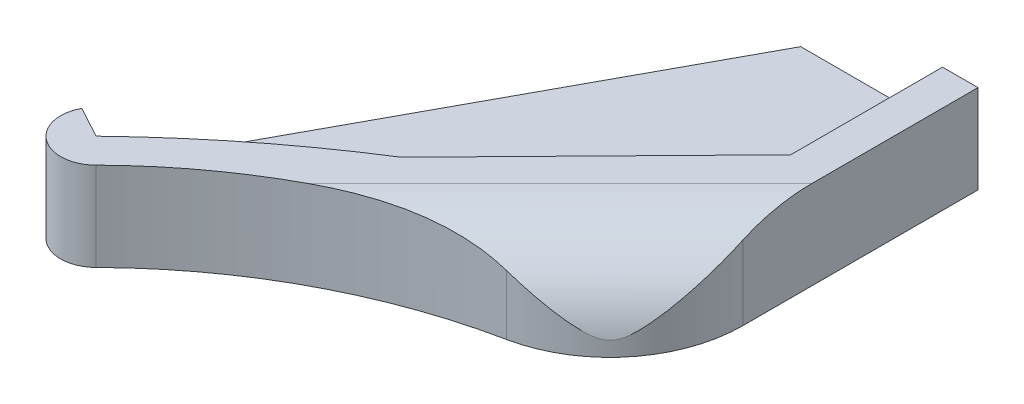
ISO-10303-21;
HEADER;
FILE_DESCRIPTION(('STEP AP214'),'2;1');
FILE_NAME('part.step','',(''),(''),'','','');
FILE_SCHEMA(('AUTOMOTIVE_DESIGN { 1 0 10303 214 1 1 1 1 }'));
ENDSEC;
DATA;
#1=APPLICATION_CONTEXT('core data for automotive mechanical design processes');
#2=APPLICATION_PROTOCOL_DEFINITION('international standard','automotive_design',2000,#1);
#3=PRODUCT_CONTEXT('',#1,'mechanical');
#4=PRODUCT('Part','Part','',(#3));
#5=PRODUCT_RELATED_PRODUCT_CATEGORY('part','',(#4));
#6=PRODUCT_DEFINITION_FORMATION('','',#4);
#7=PRODUCT_DEFINITION_CONTEXT('part definition',#1,'design');
#8=PRODUCT_DEFINITION('design','',#6,#7);
#9=PRODUCT_DEFINITION_SHAPE('','',#8);
#10=(LENGTH_UNIT() NAMED_UNIT(*) SI_UNIT(.MILLI.,.METRE.));
#11=(NAMED_UNIT(*) PLANE_ANGLE_UNIT() SI_UNIT($,.RADIAN.));
#12=(NAMED_UNIT(*) SI_UNIT($,.STERADIAN.) SOLID_ANGLE_UNIT());
#13=UNCERTAINTY_MEASURE_WITH_UNIT(LENGTH_MEASURE(1.E-05),#10,'distance_accuracy_value','');
#14=(GEOMETRIC_REPRESENTATION_CONTEXT(3) GLOBAL_UNCERTAINTY_ASSIGNED_CONTEXT((#13)) GLOBAL_UNIT_ASSIGNED_CONTEXT((#10,
#11,#12)) REPRESENTATION_CONTEXT('',''));
#15=CARTESIAN_POINT('',(0.,0.,0.));
#16=DIRECTION('',(0.,0.,1.));
#17=DIRECTION('',(1.,0.,0.));
#18=AXIS2_PLACEMENT_3D('',#15,#16,#17);
#19=CARTESIAN_POINT('',(0.,6.35,0.));
#20=DIRECTION('',(-1.,0.,0.));
#21=DIRECTION('',(0.,0.,1.));
#22=AXIS2_PLACEMENT_3D('',#19,#20,#21);
#23=PLANE('',#22);
#24=DIRECTION('',(0.,0.,-1.));
#25=VECTOR('',#24,1.);
#26=CARTESIAN_POINT('',(0.,6.35,0.));
#27=LINE('',#26,#25);
#28=CARTESIAN_POINT('',(0.,6.35,-13.4703841816038));
#29=VERTEX_POINT('',#28);
#30=CARTESIAN_POINT('',(0.,6.35,-25.4));
#31=VERTEX_POINT('',#30);
#32=EDGE_CURVE('E241',#29,#31,#27,.T.);
#33=ORIENTED_EDGE('',*,*,#32,.F.);
#34=CARTESIAN_POINT('',(0.,0.,-13.4703841816038));
#35=DIRECTION('',(-1.,0.,0.));
#36=DIRECTION('',(0.,0.,-1.));
#37=AXIS2_PLACEMENT_3D('',#34,#35,#36);
#38=ELLIPSE('',#37,8.98025612106918,6.35);
#39=CARTESIAN_POINT('',(0.,5.31791393644227,-8.56277960001953));
#40=VERTEX_POINT('',#39);
#41=EDGE_CURVE('E191',#29,#40,#38,.F.);
#42=ORIENTED_EDGE('',*,*,#41,.T.);
#43=DIRECTION('',(0.,-1.,0.));
#44=VECTOR('',#43,1.);
#45=CARTESIAN_POINT('',(0.,6.35,-8.56277960001953));
#46=LINE('',#45,#44);
#47=CARTESIAN_POINT('',(0.,0.,-8.56277960001953));
#48=VERTEX_POINT('',#47);
#49=EDGE_CURVE('E288',#40,#48,#46,.T.);
#50=ORIENTED_EDGE('',*,*,#49,.T.);
#51=DIRECTION('',(0.,0.,-1.));
#52=VECTOR('',#51,1.);
#53=CARTESIAN_POINT('',(0.,0.,0.));
#54=LINE('',#53,#52);
#55=CARTESIAN_POINT('',(0.,0.,-25.4));
#56=VERTEX_POINT('',#55);
#57=EDGE_CURVE('E262',#48,#56,#54,.T.);
#58=ORIENTED_EDGE('',*,*,#57,.T.);
#59=DIRECTION('',(0.,-1.,0.));
#60=VECTOR('',#59,1.);
#61=CARTESIAN_POINT('',(0.,6.35,-25.4));
#62=LINE('',#61,#60);
#63=EDGE_CURVE('E244',#31,#56,#62,.T.);
#64=ORIENTED_EDGE('',*,*,#63,.F.);
#65=EDGE_LOOP('',(#33,#42,#50,#58,#64));
#66=FACE_BOUND('',#65,.T.);
#67=ADVANCED_FACE('F39',(#66),#23,.F.);
#68=CARTESIAN_POINT('',(0.,6.35,38.1));
#69=DIRECTION('',(0.,-1.,0.));
#70=DIRECTION('',(0.,0.,-1.));
#71=AXIS2_PLACEMENT_3D('',#68,#69,#70);
#72=CYLINDRICAL_SURFACE('',#71,38.1);
#73=DIRECTION('',(0.,-1.,0.));
#74=VECTOR('',#73,1.);
#75=CARTESIAN_POINT('',(-7.62,6.35,0.769776319984372));
#76=LINE('',#75,#74);
#77=CARTESIAN_POINT('',(-7.62,0.,0.769776319984372));
#78=VERTEX_POINT('',#77);
#79=CARTESIAN_POINT('',(-7.62,4.29059873055108,0.769776319984372));
#80=VERTEX_POINT('',#79);
#81=EDGE_CURVE('E54',#78,#80,#76,.F.);
#82=ORIENTED_EDGE('',*,*,#81,.T.);
#83=CARTESIAN_POINT('',(-7.62000000000001,4.29059873055109,0.769776319984372));
#84=CARTESIAN_POINT('',(-7.73344611815257,4.3602475463598,0.792931669112894));
#85=CARTESIAN_POINT('',(-7.84831246156901,4.42724604694933,0.816919287510391));
#86=CARTESIAN_POINT('',(-8.08044401134508,4.55621071216545,0.866540822042958));
#87=CARTESIAN_POINT('',(-8.19770846626804,4.61817842381152,0.892174227705952));
#88=CARTESIAN_POINT('',(-8.55208398003911,4.79676785645995,0.971435203202826));
#89=CARTESIAN_POINT('',(-8.79222101781491,4.90634413389146,1.02751357086694));
#90=CARTESIAN_POINT('',(-9.27568245346419,5.10784576212204,1.14552601690801));
#91=CARTESIAN_POINT('',(-9.51896024707282,5.19991786912302,1.20740425990674));
#92=CARTESIAN_POINT('',(-10.0090418276424,5.36956751905715,1.33733703441565));
#93=CARTESIAN_POINT('',(-10.2558476892317,5.4471361213562,1.40539533745374));
#94=CARTESIAN_POINT('',(-10.751102097105,5.5893373883299,1.54743365421118));
#95=CARTESIAN_POINT('',(-10.9995483806943,5.65398509853071,1.62140663841947));
#96=CARTESIAN_POINT('',(-11.4973322927569,5.77199948766296,1.77522558253136));
#97=CARTESIAN_POINT('',(-11.7466700839568,5.82536398763828,1.85507267280664));
#98=CARTESIAN_POINT('',(-12.24547964461,5.92218561662671,2.02054173392716));
#99=CARTESIAN_POINT('',(-12.4949514189572,5.96563779935745,2.10616656038995));
#100=CARTESIAN_POINT('',(-12.99328004293,6.04381750729093,2.28303998238853));
#101=CARTESIAN_POINT('',(-13.2421368144978,6.07854397618248,2.37428925714127));
#102=CARTESIAN_POINT('',(-13.9899772799042,6.1716688445085,2.65743185339974));
#103=CARTESIAN_POINT('',(-14.4872538594311,6.21846377652822,2.85773436729726));
#104=CARTESIAN_POINT('',(-15.473939964979,6.28882255874805,3.27967315643763));
#105=CARTESIAN_POINT('',(-15.9633527053557,6.31239615124992,3.50130044219186));
#106=CARTESIAN_POINT('',(-16.7067594281657,6.33553382938096,3.85709553098095));
#107=CARTESIAN_POINT('',(-16.9641493089876,6.34116747781062,3.98387539296977));
#108=CARTESIAN_POINT('',(-17.474685851784,6.34838516359587,4.24255154353774));
#109=CARTESIAN_POINT('',(-17.7278477966669,6.34999056883707,4.3744170514507));
#110=CARTESIAN_POINT('',(-17.9794974490387,6.35,4.50911326743502));
#111=B_SPLINE_CURVE_WITH_KNOTS('',3,(#83,#84,#85,#86,#87,#88,#89,#90,#91,#92,#93,#94,#95,#96,
#97,#98,#99,#100,#101,#102,#103,#104,#105,#106,#107,#108,#109,#110),.UNSPECIFIED.,.F.,.F.,(4,2,
2,2,2,2,2,2,2,2,2,2,2,4),(0.,0.405269960914551,0.810414821323591,1.61913034402251,
2.42073361235353,3.22282940866436,4.02398570500091,4.82529657553865,5.62700643268224,
6.42881329593485,8.0419550616866,9.65441975987414,10.5152543967088,11.3715129748676),.UNSPECIFIED.);
#112=CARTESIAN_POINT('',(-17.9794974490387,6.35,4.50911326743503));
#113=VERTEX_POINT('',#112);
#114=EDGE_CURVE('E68',#80,#113,#111,.T.);
#115=ORIENTED_EDGE('',*,*,#114,.T.);
#116=CARTESIAN_POINT('',(0.,6.35,38.1));
#117=DIRECTION('',(0.,-1.,0.));
#118=DIRECTION('',(0.,0.,1.));
#119=AXIS2_PLACEMENT_3D('',#116,#117,#118);
#120=CIRCLE('',#119,38.1);
#121=CARTESIAN_POINT('',(-26.7890625,6.35,11.0083752725848));
#122=VERTEX_POINT('',#121);
#123=EDGE_CURVE('E202',#122,#113,#120,.T.);
#124=ORIENTED_EDGE('',*,*,#123,.F.);
#125=DIRECTION('',(0.,-1.,0.));
#126=VECTOR('',#125,1.);
#127=CARTESIAN_POINT('',(-26.7890625,6.35,11.0083752725848));
#128=LINE('',#127,#126);
#129=CARTESIAN_POINT('',(-26.7890625,0.,11.0083752725848));
#130=VERTEX_POINT('',#129);
#131=EDGE_CURVE('E258',#122,#130,#128,.T.);
#132=ORIENTED_EDGE('',*,*,#131,.T.);
#133=CARTESIAN_POINT('',(0.,0.,38.1));
#134=DIRECTION('',(0.,-1.,0.));
#135=DIRECTION('',(0.,0.,1.));
#136=AXIS2_PLACEMENT_3D('',#133,#134,#135);
#137=CIRCLE('',#136,38.1);
#138=EDGE_CURVE('E201',#130,#78,#137,.T.);
#139=ORIENTED_EDGE('',*,*,#138,.T.);
#140=EDGE_LOOP('',(#82,#115,#124,#132,#139));
#141=FACE_BOUND('',#140,.T.);
#142=ADVANCED_FACE('F204',(#141),#72,.F.);
#143=CARTESIAN_POINT('',(-12.7,6.35,-25.4));
#144=DIRECTION('',(0.,0.,1.));
#145=DIRECTION('',(1.,0.,0.));
#146=AXIS2_PLACEMENT_3D('',#143,#144,#145);
#147=PLANE('',#146);
#148=DIRECTION('',(-1.,0.,0.));
#149=VECTOR('',#148,1.);
#150=CARTESIAN_POINT('',(-12.7,2.54,-25.4));
#151=LINE('',#150,#149);
#152=CARTESIAN_POINT('',(-2.54,2.54,-25.4));
#153=VERTEX_POINT('',#152);
#154=CARTESIAN_POINT('',(-12.7,2.54,-25.4));
#155=VERTEX_POINT('',#154);
#156=EDGE_CURVE('E163',#153,#155,#151,.T.);
#157=ORIENTED_EDGE('',*,*,#156,.F.);
#158=DIRECTION('',(0.,1.,0.));
#159=VECTOR('',#158,1.);
#160=CARTESIAN_POINT('',(-2.54,2.54,-25.4));
#161=LINE('',#160,#159);
#162=CARTESIAN_POINT('',(-2.54,6.35,-25.4));
#163=VERTEX_POINT('',#162);
#164=EDGE_CURVE('E182',#153,#163,#161,.T.);
#165=ORIENTED_EDGE('',*,*,#164,.T.);
#166=DIRECTION('',(-1.,0.,0.));
#167=VECTOR('',#166,1.);
#168=CARTESIAN_POINT('',(-12.7,6.35,-25.4));
#169=LINE('',#168,#167);
#170=EDGE_CURVE('E248',#31,#163,#169,.T.);
#171=ORIENTED_EDGE('',*,*,#170,.F.);
#172=ORIENTED_EDGE('',*,*,#63,.T.);
#173=DIRECTION('',(-1.,0.,0.));
#174=VECTOR('',#173,1.);
#175=CARTESIAN_POINT('',(-12.7,0.,-25.4));
#176=LINE('',#175,#174);
#177=CARTESIAN_POINT('',(-12.7,0.,-25.4));
#178=VERTEX_POINT('',#177);
#179=EDGE_CURVE('E265',#56,#178,#176,.T.);
#180=ORIENTED_EDGE('',*,*,#179,.T.);
#181=DIRECTION('',(0.,-1.,0.));
#182=VECTOR('',#181,1.);
#183=CARTESIAN_POINT('',(-12.7,6.35,-25.4));
#184=LINE('',#183,#182);
#185=EDGE_CURVE('E283',#155,#178,#184,.T.);
#186=ORIENTED_EDGE('',*,*,#185,.F.);
#187=EDGE_LOOP('',(#157,#165,#171,#172,#180,#186));
#188=FACE_BOUND('',#187,.T.);
#189=ADVANCED_FACE('F229',(#188),#147,.F.);
#190=CARTESIAN_POINT('',(-30.8078190565887,6.35,7.99143292233302));
#191=DIRECTION('',(0.879062620704222,0.,0.476706313027868));
#192=DIRECTION('',(0.476706313027869,0.,-0.879062620704223));
#193=AXIS2_PLACEMENT_3D('',#190,#191,#192);
#194=PLANE('',#193);
#195=DIRECTION('',(0.,-1.,0.));
#196=VECTOR('',#195,1.);
#197=CARTESIAN_POINT('',(-30.8078190565887,6.35,7.99143292233302));
#198=LINE('',#197,#196);
#199=CARTESIAN_POINT('',(-30.8078190565887,2.54,7.99143292233302));
#200=VERTEX_POINT('',#199);
#201=CARTESIAN_POINT('',(-30.8078190565887,0.,7.99143292233302));
#202=VERTEX_POINT('',#201);
#203=EDGE_CURVE('E278',#200,#202,#198,.T.);
#204=ORIENTED_EDGE('',*,*,#203,.F.);
#205=DIRECTION('',(-0.476706313027868,0.,0.879062620704223));
#206=VECTOR('',#205,1.);
#207=CARTESIAN_POINT('',(-30.8078190565887,2.54,7.99143292233302));
#208=LINE('',#207,#206);
#209=EDGE_CURVE('E166',#155,#200,#208,.T.);
#210=ORIENTED_EDGE('',*,*,#209,.F.);
#211=ORIENTED_EDGE('',*,*,#185,.T.);
#212=DIRECTION('',(-0.476706313027868,0.,0.879062620704223));
#213=VECTOR('',#212,1.);
#214=CARTESIAN_POINT('',(-30.8078190565887,0.,7.99143292233302));
#215=LINE('',#214,#213);
#216=EDGE_CURVE('E269',#178,#202,#215,.T.);
#217=ORIENTED_EDGE('',*,*,#216,.T.);
#218=EDGE_LOOP('',(#204,#210,#211,#217));
#219=FACE_BOUND('',#218,.T.);
#220=ADVANCED_FACE('F225',(#219),#194,.F.);
#221=CARTESIAN_POINT('',(-28.575,6.35,9.2022669574238));
#222=DIRECTION('',(0.,-1.,0.));
#223=DIRECTION('',(0.,0.,-1.));
#224=AXIS2_PLACEMENT_3D('',#221,#222,#223);
#225=CYLINDRICAL_SURFACE('',#224,2.54);
#226=CARTESIAN_POINT('',(-28.575,0.,9.2022669574238));
#227=DIRECTION('',(0.,1.,0.));
#228=DIRECTION('',(0.,0.,-1.));
#229=AXIS2_PLACEMENT_3D('',#226,#227,#228);
#230=CIRCLE('',#229,2.54);
#231=EDGE_CURVE('E254',#202,#130,#230,.T.);
#232=ORIENTED_EDGE('',*,*,#231,.T.);
#233=ORIENTED_EDGE('',*,*,#131,.F.);
#234=CARTESIAN_POINT('',(-28.575,6.35,9.2022669574238));
#235=DIRECTION('',(0.,1.,0.));
#236=DIRECTION('',(0.,0.,-1.));
#237=AXIS2_PLACEMENT_3D('',#234,#235,#236);
#238=CIRCLE('',#237,2.54);
#239=CARTESIAN_POINT('',(-30.8078190565887,6.35,7.99143292233302));
#240=VERTEX_POINT('',#239);
#241=EDGE_CURVE('E251',#240,#122,#238,.T.);
#242=ORIENTED_EDGE('',*,*,#241,.F.);
#243=EDGE_CURVE('E279',#240,#200,#198,.T.);
#244=ORIENTED_EDGE('',*,*,#243,.T.);
#245=ORIENTED_EDGE('',*,*,#203,.T.);
#246=EDGE_LOOP('',(#232,#233,#242,#244,#245));
#247=FACE_BOUND('',#246,.T.);
#248=ADVANCED_FACE('F218',(#247),#225,.T.);
#249=CARTESIAN_POINT('',(0.,6.35,38.1));
#250=DIRECTION('',(0.,1.,0.));
#251=DIRECTION('',(0.,0.,1.));
#252=AXIS2_PLACEMENT_3D('',#249,#250,#251);
#253=PLANE('',#252);
#254=DIRECTION('',(0.879062620704223,0.,0.476706313027867));
#255=VECTOR('',#254,1.);
#256=CARTESIAN_POINT('',(-28.575,6.35,9.2022669574238));
#257=LINE('',#256,#255);
#258=CARTESIAN_POINT('',(-28.575,6.35,9.2022669574238));
#259=VERTEX_POINT('',#258);
#260=EDGE_CURVE('E154',#240,#259,#257,.T.);
#261=ORIENTED_EDGE('',*,*,#260,.F.);
#262=ORIENTED_EDGE('',*,*,#241,.T.);
#263=ORIENTED_EDGE('',*,*,#123,.T.);
#264=DIRECTION('',(0.707106781186546,0.,-0.707106781186549));
#265=VECTOR('',#264,1.);
#266=CARTESIAN_POINT('',(-28.1638255695137,6.35,14.6934413879101));
#267=LINE('',#266,#265);
#268=EDGE_CURVE('E181',#113,#29,#267,.T.);
#269=ORIENTED_EDGE('',*,*,#268,.T.);
#270=ORIENTED_EDGE('',*,*,#32,.T.);
#271=ORIENTED_EDGE('',*,*,#170,.T.);
#272=DIRECTION('',(0.,0.,-1.));
#273=VECTOR('',#272,1.);
#274=CARTESIAN_POINT('',(-2.54,6.35,-14.5224866300314));
#275=LINE('',#274,#273);
#276=CARTESIAN_POINT('',(-2.54,6.35,-14.5224866300314));
#277=VERTEX_POINT('',#276);
#278=EDGE_CURVE('E158',#277,#163,#275,.T.);
#279=ORIENTED_EDGE('',*,*,#278,.F.);
#280=DIRECTION('',(0.699376100771023,0.,-0.714753852504707));
#281=VECTOR('',#280,1.);
#282=CARTESIAN_POINT('',(-16.3370700412787,6.35,-0.422049176693298));
#283=LINE('',#282,#281);
#284=CARTESIAN_POINT('',(-16.3370700412788,6.35,-0.422049176693296));
#285=VERTEX_POINT('',#284);
#286=EDGE_CURVE('E173',#285,#277,#283,.T.);
#287=ORIENTED_EDGE('',*,*,#286,.F.);
#288=CARTESIAN_POINT('',(24.4021447741042,6.35,63.9732641327866));
#289=DIRECTION('',(0.,-1.,0.));
#290=DIRECTION('',(0.,0.,-1.));
#291=AXIS2_PLACEMENT_3D('',#288,#289,#290);
#292=CIRCLE('',#291,76.2);
#293=EDGE_CURVE('E61',#259,#285,#292,.T.);
#294=ORIENTED_EDGE('',*,*,#293,.F.);
#295=EDGE_LOOP('',(#261,#262,#263,#269,#270,#271,#279,#287,#294));
#296=FACE_BOUND('',#295,.T.);
#297=ADVANCED_FACE('F213',(#296),#253,.T.);
#298=CARTESIAN_POINT('',(0.,0.,38.1));
#299=DIRECTION('',(0.,1.,0.));
#300=DIRECTION('',(0.,0.,1.));
#301=AXIS2_PLACEMENT_3D('',#298,#299,#300);
#302=PLANE('',#301);
#303=ORIENTED_EDGE('',*,*,#57,.F.);
#304=CARTESIAN_POINT('',(-9.525,0.,-8.56277960001953));
#305=DIRECTION('',(0.,1.,0.));
#306=DIRECTION('',(0.,0.,1.));
#307=AXIS2_PLACEMENT_3D('',#304,#305,#306);
#308=CIRCLE('',#307,9.525);
#309=EDGE_CURVE('E291',#48,#78,#308,.F.);
#310=ORIENTED_EDGE('',*,*,#309,.T.);
#311=ORIENTED_EDGE('',*,*,#138,.F.);
#312=ORIENTED_EDGE('',*,*,#231,.F.);
#313=ORIENTED_EDGE('',*,*,#216,.F.);
#314=ORIENTED_EDGE('',*,*,#179,.F.);
#315=EDGE_LOOP('',(#303,#310,#311,#312,#313,#314));
#316=FACE_BOUND('',#315,.T.);
#317=ADVANCED_FACE('F217',(#316),#302,.F.);
#318=CARTESIAN_POINT('',(-9.525,6.35,-8.56277960001953));
#319=DIRECTION('',(0.,-1.,0.));
#320=DIRECTION('',(0.,0.,-1.));
#321=AXIS2_PLACEMENT_3D('',#318,#319,#320);
#322=CYLINDRICAL_SURFACE('',#321,9.525);
#323=CARTESIAN_POINT('',(-7.62,4.29059873055108,0.769776319984376));
#324=CARTESIAN_POINT('',(-7.46589395079717,4.19597946382839,0.738312432244239));
#325=CARTESIAN_POINT('',(-7.31353984179832,4.09974209003675,0.70324419673798));
#326=CARTESIAN_POINT('',(-7.01239209240025,3.90457387592975,0.626160187667278));
#327=CARTESIAN_POINT('',(-6.86359782099501,3.8056435197109,0.584145655984423));
#328=CARTESIAN_POINT('',(-6.56948339137676,3.60553812715905,0.493391675411468));
#329=CARTESIAN_POINT('',(-6.42416536302001,3.50436178439344,0.444648221640721));
#330=CARTESIAN_POINT('',(-6.13706849982056,3.30034933451443,0.340638845856061));
#331=CARTESIAN_POINT('',(-5.9952897745611,3.19751317617206,0.28537272219119));
#332=CARTESIAN_POINT('',(-5.71369704470623,2.98965190533189,0.167806035487778));
#333=CARTESIAN_POINT('',(-5.5739206161427,2.88461514591277,0.105436156182349));
#334=CARTESIAN_POINT('',(-5.29776415671709,2.67415589650177,-0.0258315949808836));
#335=CARTESIAN_POINT('',(-5.1613841385917,2.56873340506506,-0.094729491314406));
#336=CARTESIAN_POINT('',(-4.89185508523344,2.35855790592811,-0.239141421162736));
#337=CARTESIAN_POINT('',(-4.75870353552431,2.25380442729249,-0.314650079766695));
#338=CARTESIAN_POINT('',(-4.49505648808301,2.04633954955019,-0.472727388206669));
#339=CARTESIAN_POINT('',(-4.36456033648726,1.9436276478749,-0.555294273334366));
#340=CARTESIAN_POINT('',(-4.1680343880755,1.79149058616172,-0.686549665626648));
#341=CARTESIAN_POINT('',(-4.10137312401387,1.74033607587198,-0.732292967127723));
#342=CARTESIAN_POINT('',(-3.96828652308697,1.63991101494744,-0.826165483709511));
#343=CARTESIAN_POINT('',(-3.90186121146994,1.59064066072802,-0.874294946343058));
#344=CARTESIAN_POINT('',(-3.76895766381469,1.49488526726615,-0.973282157446872));
#345=CARTESIAN_POINT('',(-3.70247941723585,1.44840133301037,-1.02414097331797));
#346=CARTESIAN_POINT('',(-3.5691771215262,1.35970998522226,-1.12900608607731));
#347=CARTESIAN_POINT('',(-3.50235322964623,1.31750078072327,-1.18301104977255));
#348=CARTESIAN_POINT('',(-3.35657578328349,1.23299044357629,-1.30422485676273));
#349=CARTESIAN_POINT('',(-3.27747975128756,1.19187779106501,-1.37212326138667));
#350=CARTESIAN_POINT('',(-3.11846039767112,1.12443678996332,-1.51344751926051));
#351=CARTESIAN_POINT('',(-3.03854515779311,1.09801905463214,-1.58683680247933));
#352=CARTESIAN_POINT('',(-2.87748703230435,1.06631231017818,-1.74012139829343));
#353=CARTESIAN_POINT('',(-2.79634801548581,1.06141316441378,-1.82011021385096));
#354=CARTESIAN_POINT('',(-2.63793823022118,1.07569804895586,-1.98197948912797));
#355=CARTESIAN_POINT('',(-2.56067938570656,1.09495209298805,-2.06386476968261));
#356=CARTESIAN_POINT('',(-2.4236775080687,1.14702465077914,-2.21410941467411));
#357=CARTESIAN_POINT('',(-2.36305970252763,1.177327970818,-2.28262782260571));
#358=CARTESIAN_POINT('',(-2.24585729905658,1.2465304214516,-2.4188570930524));
#359=CARTESIAN_POINT('',(-2.18927924174623,1.28544309162728,-2.48656650451713));
#360=CARTESIAN_POINT('',(-2.0791437018258,1.36923161361474,-2.62202633254666));
#361=CARTESIAN_POINT('',(-2.0256215329107,1.41416251741943,-2.68977056124633));
#362=CARTESIAN_POINT('',(-1.92167532096648,1.5076813711541,-2.82498084181984));
#363=CARTESIAN_POINT('',(-1.87124921118513,1.55626683222512,-2.89244705059111));
#364=CARTESIAN_POINT('',(-1.73182042220742,1.69758589249327,-3.08413066543528));
#365=CARTESIAN_POINT('',(-1.64592888722592,1.79317496853766,-3.20849488063488));
#366=CARTESIAN_POINT('',(-1.48137545676252,1.98816936488388,-3.45904046189661));
#367=CARTESIAN_POINT('',(-1.40271701297152,2.087576475434,-3.58522266263507));
#368=CARTESIAN_POINT('',(-1.25180424845148,2.28825790100971,-3.84029648726598));
#369=CARTESIAN_POINT('',(-1.17955998512387,2.38953485777378,-3.96919198738609));
#370=CARTESIAN_POINT('',(-1.04128815491946,2.59251402759081,-4.22988147154143));
#371=CARTESIAN_POINT('',(-0.975259352788039,2.69421615193238,-4.36167487320061));
#372=CARTESIAN_POINT('',(-0.786997950263402,2.99751711236787,-4.76027353090917));
#373=CARTESIAN_POINT('',(-0.673692731050792,3.19853374246743,-5.03181590103468));
#374=CARTESIAN_POINT('',(-0.471603565407483,3.59414185310201,-5.5880469099969));
#375=CARTESIAN_POINT('',(-0.382798029670551,3.78873885664418,-5.87272371474865));
#376=CARTESIAN_POINT('',(-0.257895766429666,4.10110374883804,-6.35271212157432));
#377=CARTESIAN_POINT('',(-0.214251124696544,4.22179050962642,-6.54418252936225));
#378=CARTESIAN_POINT('',(-0.138461140437999,4.45787570549494,-6.93255064237455));
#379=CARTESIAN_POINT('',(-0.106313208990697,4.57327532606616,-7.12944711494397));
#380=CARTESIAN_POINT('',(-0.054051568760403,4.7982309492581,-7.52949855426577));
#381=CARTESIAN_POINT('',(-0.0340004210164349,4.90775394884267,-7.73268043834107));
#382=CARTESIAN_POINT('',(-0.00697491189992447,5.11903277717965,-8.14408688455107));
#383=CARTESIAN_POINT('',(-1.11088145775119E-05,5.22078227118736,-8.352315381022));
#384=CARTESIAN_POINT('',(0.,5.31791393644227,-8.56277960001953));
#385=B_SPLINE_CURVE_WITH_KNOTS('',3,(#323,#324,#325,#326,#327,#328,#329,#330,#331,#332,#333,
#334,#335,#336,#337,#338,#339,#340,#341,#342,#343,#344,#345,#346,#347,#348,#349,#350,#351,#352,
#353,#354,#355,#356,#357,#358,#359,#360,#361,#362,#363,#364,#365,#366,#367,#368,#369,#370,#371,
#372,#373,#374,#375,#376,#377,#378,#379,#380,#381,#382,#383,#384),.UNSPECIFIED.,.F.,.F.,(4,2,2,
2,2,2,2,2,2,2,2,2,2,2,2,2,2,2,2,2,2,2,2,2,2,2,2,2,2,2,4),(0.,0.550578592471614,1.10105885693151,
1.65186817702228,2.20269453006707,2.75945006268479,3.31620768284772,3.87251675949045,
4.42868715144663,4.71566440222523,5.00267148808086,5.28979164700814,5.57679101031602,
5.91226245827681,6.2456703279369,6.58509444140655,6.92550473332875,7.21402285629997,
7.50299798687739,7.79482453114729,8.08645410182585,8.62263976473101,9.15907998622904,
9.6963470121532,10.2335070357236,11.3014036901519,12.3683562780911,13.0595000438477,
13.7504880741322,14.4450197241339,15.1401114512284),.UNSPECIFIED.);
#386=EDGE_CURVE('E11',#80,#40,#385,.T.);
#387=ORIENTED_EDGE('',*,*,#386,.F.);
#388=ORIENTED_EDGE('',*,*,#81,.F.);
#389=ORIENTED_EDGE('',*,*,#309,.F.);
#390=ORIENTED_EDGE('',*,*,#49,.F.);
#391=EDGE_LOOP('',(#387,#388,#389,#390));
#392=FACE_BOUND('',#391,.T.);
#393=ADVANCED_FACE('F41',(#392),#322,.T.);
#394=CARTESIAN_POINT('',(-28.1638255695137,0.,14.6934413879101));
#395=DIRECTION('',(0.707106781186546,0.,-0.707106781186549));
#396=DIRECTION('',(-0.707106781186549,0.,-0.707106781186546));
#397=AXIS2_PLACEMENT_3D('',#394,#395,#396);
#398=CYLINDRICAL_SURFACE('',#397,6.35);
#399=ORIENTED_EDGE('',*,*,#386,.T.);
#400=ORIENTED_EDGE('',*,*,#41,.F.);
#401=ORIENTED_EDGE('',*,*,#268,.F.);
#402=ORIENTED_EDGE('',*,*,#114,.F.);
#403=EDGE_LOOP('',(#399,#400,#401,#402));
#404=FACE_BOUND('',#403,.T.);
#405=ADVANCED_FACE('F207',(#404),#398,.T.);
#406=CARTESIAN_POINT('',(24.4021447741042,2.54,63.9732641327866));
#407=DIRECTION('',(0.,1.,0.));
#408=DIRECTION('',(0.,0.,1.));
#409=AXIS2_PLACEMENT_3D('',#406,#407,#408);
#410=CYLINDRICAL_SURFACE('',#409,76.2);
#411=ORIENTED_EDGE('',*,*,#293,.T.);
#412=DIRECTION('',(0.,1.,0.));
#413=VECTOR('',#412,1.);
#414=CARTESIAN_POINT('',(-16.3370700412787,2.54,-0.422049176693298));
#415=LINE('',#414,#413);
#416=CARTESIAN_POINT('',(-16.3370700412787,2.54,-0.422049176693298));
#417=VERTEX_POINT('',#416);
#418=EDGE_CURVE('E129',#417,#285,#415,.T.);
#419=ORIENTED_EDGE('',*,*,#418,.F.);
#420=CARTESIAN_POINT('',(24.4021447741042,2.54,63.9732641327866));
#421=DIRECTION('',(0.,-1.,0.));
#422=DIRECTION('',(0.,0.,-1.));
#423=AXIS2_PLACEMENT_3D('',#420,#421,#422);
#424=CIRCLE('',#423,76.2);
#425=CARTESIAN_POINT('',(-28.575,2.54,9.2022669574238));
#426=VERTEX_POINT('',#425);
#427=EDGE_CURVE('E133',#426,#417,#424,.T.);
#428=ORIENTED_EDGE('',*,*,#427,.F.);
#429=DIRECTION('',(0.,1.,0.));
#430=VECTOR('',#429,1.);
#431=CARTESIAN_POINT('',(-28.575,2.54,9.2022669574238));
#432=LINE('',#431,#430);
#433=EDGE_CURVE('E178',#426,#259,#432,.T.);
#434=ORIENTED_EDGE('',*,*,#433,.T.);
#435=EDGE_LOOP('',(#411,#419,#428,#434));
#436=FACE_BOUND('',#435,.T.);
#437=ADVANCED_FACE('F131',(#436),#410,.T.);
#438=CARTESIAN_POINT('',(-28.575,2.54,9.2022669574238));
#439=DIRECTION('',(-0.476706313027867,0.,0.879062620704223));
#440=DIRECTION('',(0.879062620704223,0.,0.476706313027867));
#441=AXIS2_PLACEMENT_3D('',#438,#439,#440);
#442=PLANE('',#441);
#443=ORIENTED_EDGE('',*,*,#260,.T.);
#444=ORIENTED_EDGE('',*,*,#433,.F.);
#445=DIRECTION('',(0.879062620704223,0.,0.476706313027867));
#446=VECTOR('',#445,1.);
#447=CARTESIAN_POINT('',(-28.575,2.54,9.2022669574238));
#448=LINE('',#447,#446);
#449=EDGE_CURVE('E140',#200,#426,#448,.T.);
#450=ORIENTED_EDGE('',*,*,#449,.F.);
#451=ORIENTED_EDGE('',*,*,#243,.F.);
#452=EDGE_LOOP('',(#443,#444,#450,#451));
#453=FACE_BOUND('',#452,.T.);
#454=ADVANCED_FACE('F315',(#453),#442,.F.);
#455=CARTESIAN_POINT('',(-2.54,2.54,-14.5224866300314));
#456=DIRECTION('',(1.,0.,0.));
#457=DIRECTION('',(0.,0.,-1.));
#458=AXIS2_PLACEMENT_3D('',#455,#456,#457);
#459=PLANE('',#458);
#460=ORIENTED_EDGE('',*,*,#278,.T.);
#461=ORIENTED_EDGE('',*,*,#164,.F.);
#462=DIRECTION('',(0.,0.,-1.));
#463=VECTOR('',#462,1.);
#464=CARTESIAN_POINT('',(-2.54,2.54,-14.5224866300314));
#465=LINE('',#464,#463);
#466=CARTESIAN_POINT('',(-2.54,2.54,-14.5224866300314));
#467=VERTEX_POINT('',#466);
#468=EDGE_CURVE('E149',#467,#153,#465,.T.);
#469=ORIENTED_EDGE('',*,*,#468,.F.);
#470=DIRECTION('',(0.,1.,0.));
#471=VECTOR('',#470,1.);
#472=CARTESIAN_POINT('',(-2.54,2.54,-14.5224866300314));
#473=LINE('',#472,#471);
#474=EDGE_CURVE('E139',#467,#277,#473,.T.);
#475=ORIENTED_EDGE('',*,*,#474,.T.);
#476=EDGE_LOOP('',(#460,#461,#469,#475));
#477=FACE_BOUND('',#476,.T.);
#478=ADVANCED_FACE('F311',(#477),#459,.F.);
#479=CARTESIAN_POINT('',(-16.3370700412787,2.54,-0.422049176693298));
#480=DIRECTION('',(0.714753852504707,0.,0.699376100771023));
#481=DIRECTION('',(0.699376100771023,0.,-0.714753852504707));
#482=AXIS2_PLACEMENT_3D('',#479,#480,#481);
#483=PLANE('',#482);
#484=ORIENTED_EDGE('',*,*,#286,.T.);
#485=ORIENTED_EDGE('',*,*,#474,.F.);
#486=DIRECTION('',(0.699376100771023,0.,-0.714753852504707));
#487=VECTOR('',#486,1.);
#488=CARTESIAN_POINT('',(-16.3370700412787,2.54,-0.422049176693298));
#489=LINE('',#488,#487);
#490=EDGE_CURVE('E143',#417,#467,#489,.T.);
#491=ORIENTED_EDGE('',*,*,#490,.F.);
#492=ORIENTED_EDGE('',*,*,#418,.T.);
#493=EDGE_LOOP('',(#484,#485,#491,#492));
#494=FACE_BOUND('',#493,.T.);
#495=ADVANCED_FACE('F144',(#494),#483,.F.);
#496=CARTESIAN_POINT('',(24.4021447741042,2.54,63.9732641327866));
#497=DIRECTION('',(0.,-1.,0.));
#498=DIRECTION('',(0.,0.,-1.));
#499=AXIS2_PLACEMENT_3D('',#496,#497,#498);
#500=PLANE('',#499);
#501=ORIENTED_EDGE('',*,*,#427,.T.);
#502=ORIENTED_EDGE('',*,*,#490,.T.);
#503=ORIENTED_EDGE('',*,*,#468,.T.);
#504=ORIENTED_EDGE('',*,*,#156,.T.);
#505=ORIENTED_EDGE('',*,*,#209,.T.);
#506=ORIENTED_EDGE('',*,*,#449,.T.);
#507=EDGE_LOOP('',(#501,#502,#503,#504,#505,#506));
#508=FACE_BOUND('',#507,.T.);
#509=ADVANCED_FACE('F151',(#508),#500,.F.);
#510=CLOSED_SHELL('',(#67,#142,#189,#220,#248,#297,#317,#393,#405,#437,#454,#478,#495,#509));
#511=MANIFOLD_SOLID_BREP('B2',#510);
#512=ADVANCED_BREP_SHAPE_REPRESENTATION('',(#18,#511),#14);
#513=SHAPE_DEFINITION_REPRESENTATION(#9,#512);
ENDSEC;
END-ISO-10303-21;
